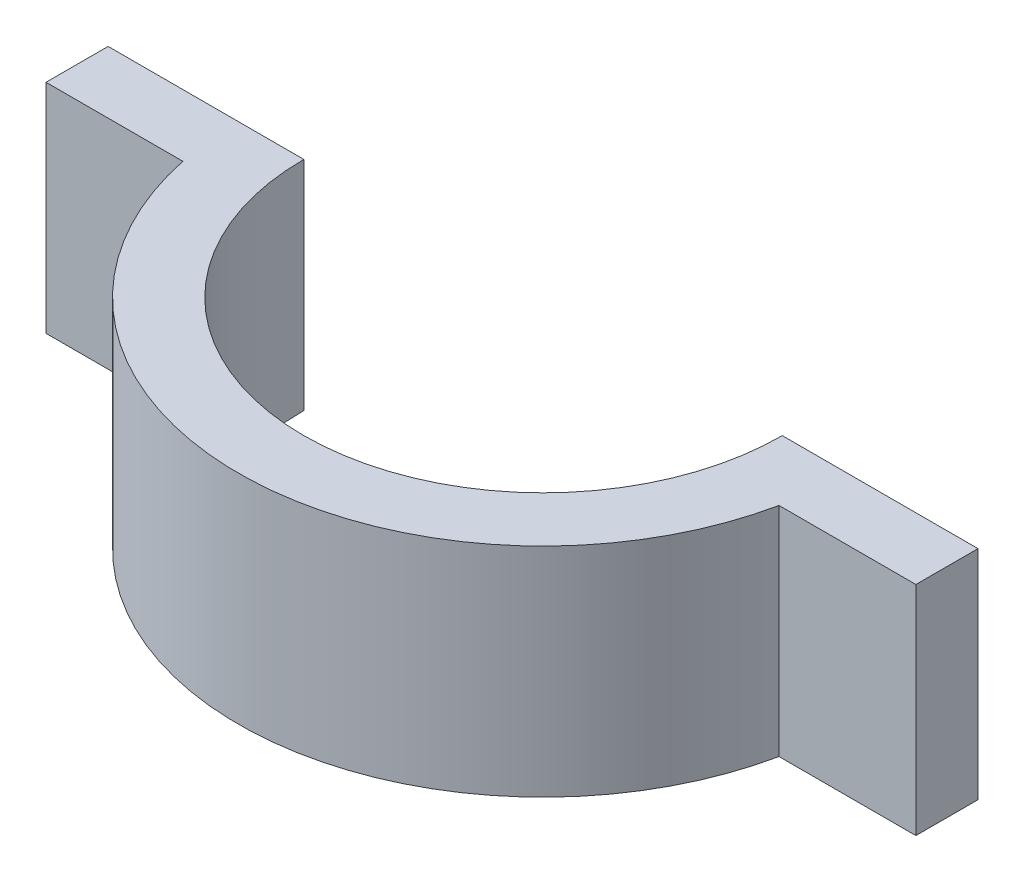
ISO-10303-21;
HEADER;
FILE_DESCRIPTION(('STEP AP214'),'2;1');
FILE_NAME('part.step','',(''),(''),'','','');
FILE_SCHEMA(('AUTOMOTIVE_DESIGN { 1 0 10303 214 1 1 1 1 }'));
ENDSEC;
DATA;
#1=APPLICATION_CONTEXT('core data for automotive mechanical design processes');
#2=APPLICATION_PROTOCOL_DEFINITION('international standard','automotive_design',2000,#1);
#3=PRODUCT_CONTEXT('',#1,'mechanical');
#4=PRODUCT('Part','Part','',(#3));
#5=PRODUCT_RELATED_PRODUCT_CATEGORY('part','',(#4));
#6=PRODUCT_DEFINITION_FORMATION('','',#4);
#7=PRODUCT_DEFINITION_CONTEXT('part definition',#1,'design');
#8=PRODUCT_DEFINITION('design','',#6,#7);
#9=PRODUCT_DEFINITION_SHAPE('','',#8);
#10=(LENGTH_UNIT() NAMED_UNIT(*) SI_UNIT(.MILLI.,.METRE.));
#11=(NAMED_UNIT(*) PLANE_ANGLE_UNIT() SI_UNIT($,.RADIAN.));
#12=(NAMED_UNIT(*) SI_UNIT($,.STERADIAN.) SOLID_ANGLE_UNIT());
#13=UNCERTAINTY_MEASURE_WITH_UNIT(LENGTH_MEASURE(1.E-05),#10,'distance_accuracy_value','');
#14=(GEOMETRIC_REPRESENTATION_CONTEXT(3) GLOBAL_UNCERTAINTY_ASSIGNED_CONTEXT((#13)) GLOBAL_UNIT_ASSIGNED_CONTEXT((#10,
#11,#12)) REPRESENTATION_CONTEXT('',''));
#15=CARTESIAN_POINT('',(0.,0.,0.));
#16=DIRECTION('',(0.,0.,1.));
#17=DIRECTION('',(1.,0.,0.));
#18=AXIS2_PLACEMENT_3D('',#15,#16,#17);
#19=CARTESIAN_POINT('',(0.,50.,0.));
#20=DIRECTION('',(0.,0.,1.));
#21=DIRECTION('',(1.,0.,0.));
#22=AXIS2_PLACEMENT_3D('',#19,#20,#21);
#23=PLANE('',#22);
#24=DIRECTION('',(-1.,0.,0.));
#25=VECTOR('',#24,1.);
#26=CARTESIAN_POINT('',(0.,0.,0.));
#27=LINE('',#26,#25);
#28=CARTESIAN_POINT('',(100.,0.,0.));
#29=VERTEX_POINT('',#28);
#30=CARTESIAN_POINT('',(55.,0.,0.));
#31=VERTEX_POINT('',#30);
#32=EDGE_CURVE('E122',#29,#31,#27,.T.);
#33=ORIENTED_EDGE('',*,*,#32,.T.);
#34=DIRECTION('',(0.,1.,0.));
#35=VECTOR('',#34,1.);
#36=CARTESIAN_POINT('',(55.,-150.,0.));
#37=LINE('',#36,#35);
#38=CARTESIAN_POINT('',(55.,50.,0.));
#39=VERTEX_POINT('',#38);
#40=EDGE_CURVE('E113',#31,#39,#37,.T.);
#41=ORIENTED_EDGE('',*,*,#40,.T.);
#42=DIRECTION('',(-1.,0.,0.));
#43=VECTOR('',#42,1.);
#44=CARTESIAN_POINT('',(0.,50.,0.));
#45=LINE('',#44,#43);
#46=CARTESIAN_POINT('',(100.,50.,0.));
#47=VERTEX_POINT('',#46);
#48=EDGE_CURVE('E55',#47,#39,#45,.T.);
#49=ORIENTED_EDGE('',*,*,#48,.F.);
#50=DIRECTION('',(0.,-1.,0.));
#51=VECTOR('',#50,1.);
#52=CARTESIAN_POINT('',(100.,50.,0.));
#53=LINE('',#52,#51);
#54=EDGE_CURVE('E206',#47,#29,#53,.T.);
#55=ORIENTED_EDGE('',*,*,#54,.T.);
#56=EDGE_LOOP('',(#33,#41,#49,#55));
#57=FACE_BOUND('',#56,.T.);
#58=ADVANCED_FACE('F45',(#57),#23,.F.);
#59=CARTESIAN_POINT('',(0.,50.,0.));
#60=DIRECTION('',(0.,-1.,0.));
#61=DIRECTION('',(0.,0.,-1.));
#62=AXIS2_PLACEMENT_3D('',#59,#60,#61);
#63=CYLINDRICAL_SURFACE('',#62,55.);
#64=CARTESIAN_POINT('',(0.,50.,0.));
#65=DIRECTION('',(0.,1.,0.));
#66=DIRECTION('',(0.,0.,1.));
#67=AXIS2_PLACEMENT_3D('',#64,#65,#66);
#68=CIRCLE('',#67,55.);
#69=CARTESIAN_POINT('',(-55.,50.,0.));
#70=VERTEX_POINT('',#69);
#71=EDGE_CURVE('E111',#70,#39,#68,.T.);
#72=ORIENTED_EDGE('',*,*,#71,.T.);
#73=ORIENTED_EDGE('',*,*,#40,.F.);
#74=CARTESIAN_POINT('',(0.,0.,0.));
#75=DIRECTION('',(0.,1.,0.));
#76=DIRECTION('',(0.,0.,1.));
#77=AXIS2_PLACEMENT_3D('',#74,#75,#76);
#78=CIRCLE('',#77,55.);
#79=CARTESIAN_POINT('',(-55.,0.,0.));
#80=VERTEX_POINT('',#79);
#81=EDGE_CURVE('E139',#80,#31,#78,.T.);
#82=ORIENTED_EDGE('',*,*,#81,.F.);
#83=DIRECTION('',(0.,1.,0.));
#84=VECTOR('',#83,1.);
#85=CARTESIAN_POINT('',(-55.,-150.,0.));
#86=LINE('',#85,#84);
#87=EDGE_CURVE('E116',#70,#80,#86,.F.);
#88=ORIENTED_EDGE('',*,*,#87,.F.);
#89=EDGE_LOOP('',(#72,#73,#82,#88));
#90=FACE_BOUND('',#89,.T.);
#91=ADVANCED_FACE('F47',(#90),#63,.F.);
#92=CARTESIAN_POINT('',(0.,50.,0.));
#93=DIRECTION('',(0.,-1.,0.));
#94=DIRECTION('',(0.,0.,-1.));
#95=AXIS2_PLACEMENT_3D('',#92,#93,#94);
#96=CYLINDRICAL_SURFACE('',#95,70.);
#97=DIRECTION('',(0.,-1.,0.));
#98=VECTOR('',#97,1.);
#99=CARTESIAN_POINT('',(68.5275141136973,50.,14.2821500271149));
#100=LINE('',#99,#98);
#101=CARTESIAN_POINT('',(68.5275141136973,50.,14.2821500271149));
#102=VERTEX_POINT('',#101);
#103=CARTESIAN_POINT('',(68.5275141136973,0.,14.2821500271149));
#104=VERTEX_POINT('',#103);
#105=EDGE_CURVE('E141',#102,#104,#100,.T.);
#106=ORIENTED_EDGE('',*,*,#105,.F.);
#107=CARTESIAN_POINT('',(0.,50.,0.));
#108=DIRECTION('',(0.,1.,0.));
#109=DIRECTION('',(0.,0.,1.));
#110=AXIS2_PLACEMENT_3D('',#107,#108,#109);
#111=CIRCLE('',#110,70.);
#112=CARTESIAN_POINT('',(-68.5275141136973,50.,14.2821500271149));
#113=VERTEX_POINT('',#112);
#114=EDGE_CURVE('E11',#113,#102,#111,.T.);
#115=ORIENTED_EDGE('',*,*,#114,.F.);
#116=DIRECTION('',(0.,-1.,0.));
#117=VECTOR('',#116,1.);
#118=CARTESIAN_POINT('',(-68.5275141136973,50.,14.2821500271149));
#119=LINE('',#118,#117);
#120=CARTESIAN_POINT('',(-68.5275141136973,0.,14.2821500271149));
#121=VERTEX_POINT('',#120);
#122=EDGE_CURVE('E65',#121,#113,#119,.F.);
#123=ORIENTED_EDGE('',*,*,#122,.F.);
#124=CARTESIAN_POINT('',(0.,0.,0.));
#125=DIRECTION('',(0.,1.,0.));
#126=DIRECTION('',(0.,0.,1.));
#127=AXIS2_PLACEMENT_3D('',#124,#125,#126);
#128=CIRCLE('',#127,70.);
#129=EDGE_CURVE('E49',#121,#104,#128,.T.);
#130=ORIENTED_EDGE('',*,*,#129,.T.);
#131=EDGE_LOOP('',(#106,#115,#123,#130));
#132=FACE_BOUND('',#131,.T.);
#133=ADVANCED_FACE('F150',(#132),#96,.T.);
#134=CARTESIAN_POINT('',(-100.,50.,0.));
#135=VERTEX_POINT('',#134);
#136=EDGE_CURVE('E121',#70,#135,#45,.T.);
#137=ORIENTED_EDGE('',*,*,#136,.F.);
#138=ORIENTED_EDGE('',*,*,#87,.T.);
#139=CARTESIAN_POINT('',(-100.,0.,0.));
#140=VERTEX_POINT('',#139);
#141=EDGE_CURVE('E143',#80,#140,#27,.T.);
#142=ORIENTED_EDGE('',*,*,#141,.T.);
#143=DIRECTION('',(0.,-1.,0.));
#144=VECTOR('',#143,1.);
#145=CARTESIAN_POINT('',(-100.,50.,0.));
#146=LINE('',#145,#144);
#147=EDGE_CURVE('E193',#135,#140,#146,.T.);
#148=ORIENTED_EDGE('',*,*,#147,.F.);
#149=EDGE_LOOP('',(#137,#138,#142,#148));
#150=FACE_BOUND('',#149,.T.);
#151=ADVANCED_FACE('F200',(#150),#23,.F.);
#152=CARTESIAN_POINT('',(0.,50.,0.));
#153=DIRECTION('',(0.,1.,0.));
#154=DIRECTION('',(0.,0.,1.));
#155=AXIS2_PLACEMENT_3D('',#152,#153,#154);
#156=PLANE('',#155);
#157=ORIENTED_EDGE('',*,*,#48,.T.);
#158=ORIENTED_EDGE('',*,*,#71,.F.);
#159=ORIENTED_EDGE('',*,*,#136,.T.);
#160=DIRECTION('',(0.,0.,-1.));
#161=VECTOR('',#160,1.);
#162=CARTESIAN_POINT('',(-100.,50.,14.2821500271149));
#163=LINE('',#162,#161);
#164=CARTESIAN_POINT('',(-100.,50.,14.2821500271149));
#165=VERTEX_POINT('',#164);
#166=EDGE_CURVE('E128',#165,#135,#163,.T.);
#167=ORIENTED_EDGE('',*,*,#166,.F.);
#168=DIRECTION('',(-1.,0.,0.));
#169=VECTOR('',#168,1.);
#170=CARTESIAN_POINT('',(100.,50.,14.2821500271149));
#171=LINE('',#170,#169);
#172=EDGE_CURVE('E171',#113,#165,#171,.T.);
#173=ORIENTED_EDGE('',*,*,#172,.F.);
#174=ORIENTED_EDGE('',*,*,#114,.T.);
#175=CARTESIAN_POINT('',(100.,50.,14.2821500271149));
#176=VERTEX_POINT('',#175);
#177=EDGE_CURVE('E176',#176,#102,#171,.T.);
#178=ORIENTED_EDGE('',*,*,#177,.F.);
#179=DIRECTION('',(0.,0.,-1.));
#180=VECTOR('',#179,1.);
#181=CARTESIAN_POINT('',(100.,50.,14.2821500271149));
#182=LINE('',#181,#180);
#183=EDGE_CURVE('E133',#176,#47,#182,.T.);
#184=ORIENTED_EDGE('',*,*,#183,.T.);
#185=EDGE_LOOP('',(#157,#158,#159,#167,#173,#174,#178,#184));
#186=FACE_BOUND('',#185,.T.);
#187=ADVANCED_FACE('F131',(#186),#156,.T.);
#188=CARTESIAN_POINT('',(0.,0.,0.));
#189=DIRECTION('',(0.,1.,0.));
#190=DIRECTION('',(0.,0.,1.));
#191=AXIS2_PLACEMENT_3D('',#188,#189,#190);
#192=PLANE('',#191);
#193=ORIENTED_EDGE('',*,*,#81,.T.);
#194=ORIENTED_EDGE('',*,*,#32,.F.);
#195=DIRECTION('',(0.,0.,-1.));
#196=VECTOR('',#195,1.);
#197=CARTESIAN_POINT('',(100.,0.,14.2821500271149));
#198=LINE('',#197,#196);
#199=CARTESIAN_POINT('',(100.,0.,14.2821500271149));
#200=VERTEX_POINT('',#199);
#201=EDGE_CURVE('E172',#200,#29,#198,.T.);
#202=ORIENTED_EDGE('',*,*,#201,.F.);
#203=DIRECTION('',(-1.,0.,0.));
#204=VECTOR('',#203,1.);
#205=CARTESIAN_POINT('',(100.,0.,14.2821500271149));
#206=LINE('',#205,#204);
#207=EDGE_CURVE('E159',#200,#104,#206,.T.);
#208=ORIENTED_EDGE('',*,*,#207,.T.);
#209=ORIENTED_EDGE('',*,*,#129,.F.);
#210=CARTESIAN_POINT('',(-100.,0.,14.2821500271149));
#211=VERTEX_POINT('',#210);
#212=EDGE_CURVE('E155',#121,#211,#206,.T.);
#213=ORIENTED_EDGE('',*,*,#212,.T.);
#214=DIRECTION('',(0.,0.,-1.));
#215=VECTOR('',#214,1.);
#216=CARTESIAN_POINT('',(-100.,0.,14.2821500271149));
#217=LINE('',#216,#215);
#218=EDGE_CURVE('E190',#211,#140,#217,.T.);
#219=ORIENTED_EDGE('',*,*,#218,.T.);
#220=ORIENTED_EDGE('',*,*,#141,.F.);
#221=EDGE_LOOP('',(#193,#194,#202,#208,#209,#213,#219,#220));
#222=FACE_BOUND('',#221,.T.);
#223=ADVANCED_FACE('F154',(#222),#192,.F.);
#224=CARTESIAN_POINT('',(-100.,0.,0.));
#225=DIRECTION('',(-1.,0.,0.));
#226=DIRECTION('',(0.,0.,1.));
#227=AXIS2_PLACEMENT_3D('',#224,#225,#226);
#228=PLANE('',#227);
#229=ORIENTED_EDGE('',*,*,#166,.T.);
#230=ORIENTED_EDGE('',*,*,#147,.T.);
#231=ORIENTED_EDGE('',*,*,#218,.F.);
#232=DIRECTION('',(0.,-1.,0.));
#233=VECTOR('',#232,1.);
#234=CARTESIAN_POINT('',(-100.,50.,14.2821500271149));
#235=LINE('',#234,#233);
#236=EDGE_CURVE('E164',#165,#211,#235,.T.);
#237=ORIENTED_EDGE('',*,*,#236,.F.);
#238=EDGE_LOOP('',(#229,#230,#231,#237));
#239=FACE_BOUND('',#238,.T.);
#240=ADVANCED_FACE('F188',(#239),#228,.T.);
#241=CARTESIAN_POINT('',(100.,50.,14.2821500271149));
#242=DIRECTION('',(0.,0.,-1.));
#243=DIRECTION('',(-1.,0.,0.));
#244=AXIS2_PLACEMENT_3D('',#241,#242,#243);
#245=PLANE('',#244);
#246=ORIENTED_EDGE('',*,*,#212,.F.);
#247=ORIENTED_EDGE('',*,*,#122,.T.);
#248=ORIENTED_EDGE('',*,*,#172,.T.);
#249=ORIENTED_EDGE('',*,*,#236,.T.);
#250=EDGE_LOOP('',(#246,#247,#248,#249));
#251=FACE_BOUND('',#250,.T.);
#252=ADVANCED_FACE('F161',(#251),#245,.F.);
#253=CARTESIAN_POINT('',(100.,0.,0.));
#254=DIRECTION('',(-1.,0.,0.));
#255=DIRECTION('',(0.,0.,1.));
#256=AXIS2_PLACEMENT_3D('',#253,#254,#255);
#257=PLANE('',#256);
#258=ORIENTED_EDGE('',*,*,#183,.F.);
#259=DIRECTION('',(0.,-1.,0.));
#260=VECTOR('',#259,1.);
#261=CARTESIAN_POINT('',(100.,50.,14.2821500271149));
#262=LINE('',#261,#260);
#263=EDGE_CURVE('E167',#176,#200,#262,.T.);
#264=ORIENTED_EDGE('',*,*,#263,.T.);
#265=ORIENTED_EDGE('',*,*,#201,.T.);
#266=ORIENTED_EDGE('',*,*,#54,.F.);
#267=EDGE_LOOP('',(#258,#264,#265,#266));
#268=FACE_BOUND('',#267,.T.);
#269=ADVANCED_FACE('F211',(#268),#257,.F.);
#270=ORIENTED_EDGE('',*,*,#177,.T.);
#271=ORIENTED_EDGE('',*,*,#105,.T.);
#272=ORIENTED_EDGE('',*,*,#207,.F.);
#273=ORIENTED_EDGE('',*,*,#263,.F.);
#274=EDGE_LOOP('',(#270,#271,#272,#273));
#275=FACE_BOUND('',#274,.T.);
#276=ADVANCED_FACE('F181',(#275),#245,.F.);
#277=CLOSED_SHELL('',(#58,#91,#133,#151,#187,#223,#240,#252,#269,#276));
#278=MANIFOLD_SOLID_BREP('B2',#277);
#279=ADVANCED_BREP_SHAPE_REPRESENTATION('',(#18,#278),#14);
#280=SHAPE_DEFINITION_REPRESENTATION(#9,#279);
ENDSEC;
END-ISO-10303-21;
